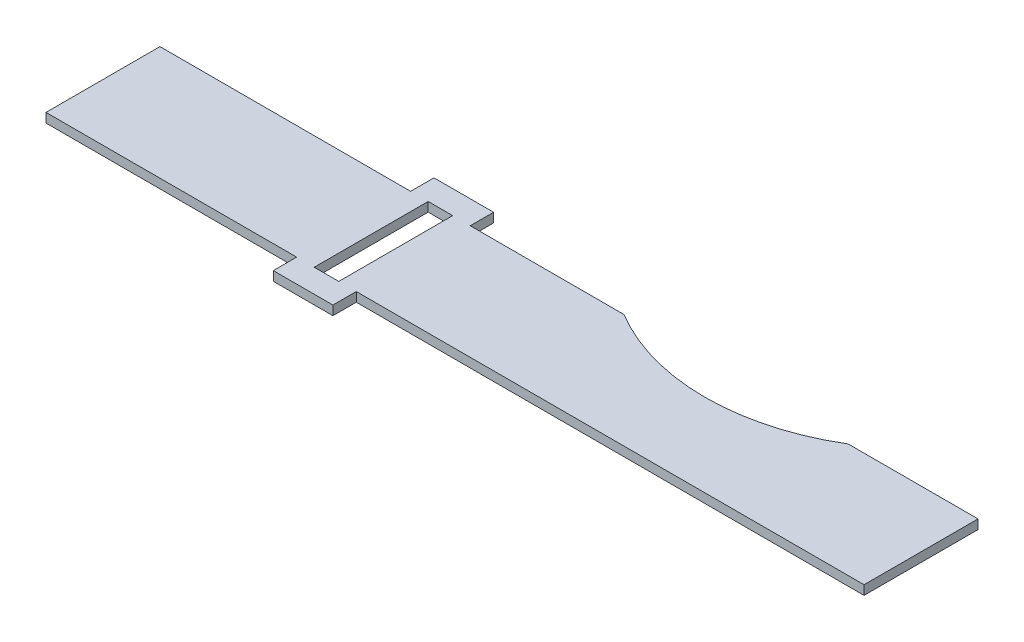
ISO-10303-21;
HEADER;
FILE_DESCRIPTION(('STEP AP214'),'2;1');
FILE_NAME('part.step','',(''),(''),'','','');
FILE_SCHEMA(('AUTOMOTIVE_DESIGN { 1 0 10303 214 1 1 1 1 }'));
ENDSEC;
DATA;
#1=APPLICATION_CONTEXT('core data for automotive mechanical design processes');
#2=APPLICATION_PROTOCOL_DEFINITION('international standard','automotive_design',2000,#1);
#3=PRODUCT_CONTEXT('',#1,'mechanical');
#4=PRODUCT('Part','Part','',(#3));
#5=PRODUCT_RELATED_PRODUCT_CATEGORY('part','',(#4));
#6=PRODUCT_DEFINITION_FORMATION('','',#4);
#7=PRODUCT_DEFINITION_CONTEXT('part definition',#1,'design');
#8=PRODUCT_DEFINITION('design','',#6,#7);
#9=PRODUCT_DEFINITION_SHAPE('','',#8);
#10=(LENGTH_UNIT() NAMED_UNIT(*) SI_UNIT(.MILLI.,.METRE.));
#11=(NAMED_UNIT(*) PLANE_ANGLE_UNIT() SI_UNIT($,.RADIAN.));
#12=(NAMED_UNIT(*) SI_UNIT($,.STERADIAN.) SOLID_ANGLE_UNIT());
#13=UNCERTAINTY_MEASURE_WITH_UNIT(LENGTH_MEASURE(1.E-05),#10,'distance_accuracy_value','');
#14=(GEOMETRIC_REPRESENTATION_CONTEXT(3) GLOBAL_UNCERTAINTY_ASSIGNED_CONTEXT((#13)) GLOBAL_UNIT_ASSIGNED_CONTEXT((#10,
#11,#12)) REPRESENTATION_CONTEXT('',''));
#15=CARTESIAN_POINT('',(0.,0.,0.));
#16=DIRECTION('',(0.,0.,1.));
#17=DIRECTION('',(1.,0.,0.));
#18=AXIS2_PLACEMENT_3D('',#15,#16,#17);
#19=CARTESIAN_POINT('',(-19.9,1.5875,0.));
#20=DIRECTION('',(1.,0.,0.));
#21=DIRECTION('',(0.,0.,-1.));
#22=AXIS2_PLACEMENT_3D('',#19,#20,#21);
#23=PLANE('',#22);
#24=DIRECTION('',(0.,0.,1.));
#25=VECTOR('',#24,1.);
#26=CARTESIAN_POINT('',(-19.9,0.,0.));
#27=LINE('',#26,#25);
#28=CARTESIAN_POINT('',(-19.9,0.,-9.75));
#29=VERTEX_POINT('',#28);
#30=CARTESIAN_POINT('',(-19.9,0.,9.75));
#31=VERTEX_POINT('',#30);
#32=EDGE_CURVE('E230',#29,#31,#27,.T.);
#33=ORIENTED_EDGE('',*,*,#32,.T.);
#34=DIRECTION('',(0.,-1.,0.));
#35=VECTOR('',#34,1.);
#36=CARTESIAN_POINT('',(-19.9,1.5875,9.75));
#37=LINE('',#36,#35);
#38=CARTESIAN_POINT('',(-19.9,1.5875,9.75));
#39=VERTEX_POINT('',#38);
#40=EDGE_CURVE('E11',#39,#31,#37,.T.);
#41=ORIENTED_EDGE('',*,*,#40,.F.);
#42=DIRECTION('',(0.,0.,1.));
#43=VECTOR('',#42,1.);
#44=CARTESIAN_POINT('',(-19.9,1.5875,0.));
#45=LINE('',#44,#43);
#46=CARTESIAN_POINT('',(-19.9,1.5875,-9.75));
#47=VERTEX_POINT('',#46);
#48=EDGE_CURVE('E183',#47,#39,#45,.T.);
#49=ORIENTED_EDGE('',*,*,#48,.F.);
#50=DIRECTION('',(0.,-1.,0.));
#51=VECTOR('',#50,1.);
#52=CARTESIAN_POINT('',(-19.9,1.5875,-9.75));
#53=LINE('',#52,#51);
#54=EDGE_CURVE('E237',#47,#29,#53,.T.);
#55=ORIENTED_EDGE('',*,*,#54,.T.);
#56=EDGE_LOOP('',(#33,#41,#49,#55));
#57=FACE_BOUND('',#56,.T.);
#58=ADVANCED_FACE('F34',(#57),#23,.F.);
#59=CARTESIAN_POINT('',(0.,1.5875,9.75));
#60=DIRECTION('',(0.,0.,-1.));
#61=DIRECTION('',(-1.,0.,0.));
#62=AXIS2_PLACEMENT_3D('',#59,#60,#61);
#63=PLANE('',#62);
#64=DIRECTION('',(1.,0.,0.));
#65=VECTOR('',#64,1.);
#66=CARTESIAN_POINT('',(0.,0.,9.75));
#67=LINE('',#66,#65);
#68=CARTESIAN_POINT('',(-24.1,0.,9.75));
#69=VERTEX_POINT('',#68);
#70=EDGE_CURVE('E175',#69,#31,#67,.T.);
#71=ORIENTED_EDGE('',*,*,#70,.F.);
#72=DIRECTION('',(0.,-1.,0.));
#73=VECTOR('',#72,1.);
#74=CARTESIAN_POINT('',(-24.1,1.5875,9.75));
#75=LINE('',#74,#73);
#76=CARTESIAN_POINT('',(-24.1,1.5875,9.75));
#77=VERTEX_POINT('',#76);
#78=EDGE_CURVE('E44',#77,#69,#75,.T.);
#79=ORIENTED_EDGE('',*,*,#78,.F.);
#80=DIRECTION('',(1.,0.,0.));
#81=VECTOR('',#80,1.);
#82=CARTESIAN_POINT('',(0.,1.5875,9.75));
#83=LINE('',#82,#81);
#84=EDGE_CURVE('E173',#77,#39,#83,.T.);
#85=ORIENTED_EDGE('',*,*,#84,.T.);
#86=ORIENTED_EDGE('',*,*,#40,.T.);
#87=EDGE_LOOP('',(#71,#79,#85,#86));
#88=FACE_BOUND('',#87,.T.);
#89=ADVANCED_FACE('F171',(#88),#63,.T.);
#90=CARTESIAN_POINT('',(-24.1,1.5875,0.));
#91=DIRECTION('',(-1.,0.,0.));
#92=DIRECTION('',(0.,0.,1.));
#93=AXIS2_PLACEMENT_3D('',#90,#91,#92);
#94=PLANE('',#93);
#95=DIRECTION('',(0.,0.,-1.));
#96=VECTOR('',#95,1.);
#97=CARTESIAN_POINT('',(-24.1,0.,0.));
#98=LINE('',#97,#96);
#99=CARTESIAN_POINT('',(-24.1,0.,-9.75));
#100=VERTEX_POINT('',#99);
#101=EDGE_CURVE('E110',#69,#100,#98,.T.);
#102=ORIENTED_EDGE('',*,*,#101,.T.);
#103=DIRECTION('',(0.,-1.,0.));
#104=VECTOR('',#103,1.);
#105=CARTESIAN_POINT('',(-24.1,1.5875,-9.75));
#106=LINE('',#105,#104);
#107=CARTESIAN_POINT('',(-24.1,1.5875,-9.75));
#108=VERTEX_POINT('',#107);
#109=EDGE_CURVE('E176',#108,#100,#106,.T.);
#110=ORIENTED_EDGE('',*,*,#109,.F.);
#111=DIRECTION('',(0.,0.,-1.));
#112=VECTOR('',#111,1.);
#113=CARTESIAN_POINT('',(-24.1,1.5875,0.));
#114=LINE('',#113,#112);
#115=EDGE_CURVE('E178',#77,#108,#114,.T.);
#116=ORIENTED_EDGE('',*,*,#115,.F.);
#117=ORIENTED_EDGE('',*,*,#78,.T.);
#118=EDGE_LOOP('',(#102,#110,#116,#117));
#119=FACE_BOUND('',#118,.T.);
#120=ADVANCED_FACE('F179',(#119),#94,.F.);
#121=CARTESIAN_POINT('',(-16.9,1.5875,0.));
#122=DIRECTION('',(-1.,0.,0.));
#123=DIRECTION('',(0.,0.,1.));
#124=AXIS2_PLACEMENT_3D('',#121,#122,#123);
#125=PLANE('',#124);
#126=DIRECTION('',(0.,0.,-1.));
#127=VECTOR('',#126,1.);
#128=CARTESIAN_POINT('',(-16.9,0.,0.));
#129=LINE('',#128,#127);
#130=CARTESIAN_POINT('',(-16.9,0.,13.75));
#131=VERTEX_POINT('',#130);
#132=CARTESIAN_POINT('',(-16.9,0.,9.75));
#133=VERTEX_POINT('',#132);
#134=EDGE_CURVE('E192',#131,#133,#129,.T.);
#135=ORIENTED_EDGE('',*,*,#134,.T.);
#136=DIRECTION('',(0.,-1.,0.));
#137=VECTOR('',#136,1.);
#138=CARTESIAN_POINT('',(-16.9,1.5875,9.75));
#139=LINE('',#138,#137);
#140=CARTESIAN_POINT('',(-16.9,1.5875,9.75));
#141=VERTEX_POINT('',#140);
#142=EDGE_CURVE('E38',#141,#133,#139,.T.);
#143=ORIENTED_EDGE('',*,*,#142,.F.);
#144=DIRECTION('',(0.,0.,-1.));
#145=VECTOR('',#144,1.);
#146=CARTESIAN_POINT('',(-16.9,1.5875,0.));
#147=LINE('',#146,#145);
#148=CARTESIAN_POINT('',(-16.9,1.5875,13.75));
#149=VERTEX_POINT('',#148);
#150=EDGE_CURVE('E236',#149,#141,#147,.T.);
#151=ORIENTED_EDGE('',*,*,#150,.F.);
#152=DIRECTION('',(0.,-1.,0.));
#153=VECTOR('',#152,1.);
#154=CARTESIAN_POINT('',(-16.9,1.5875,13.75));
#155=LINE('',#154,#153);
#156=EDGE_CURVE('E191',#149,#131,#155,.T.);
#157=ORIENTED_EDGE('',*,*,#156,.T.);
#158=EDGE_LOOP('',(#135,#143,#151,#157));
#159=FACE_BOUND('',#158,.T.);
#160=ADVANCED_FACE('F36',(#159),#125,.F.);
#161=CARTESIAN_POINT('',(0.,1.5875,9.75));
#162=DIRECTION('',(0.,0.,-1.));
#163=DIRECTION('',(-1.,0.,0.));
#164=AXIS2_PLACEMENT_3D('',#161,#162,#163);
#165=PLANE('',#164);
#166=DIRECTION('',(1.,0.,0.));
#167=VECTOR('',#166,1.);
#168=CARTESIAN_POINT('',(0.,0.,9.75));
#169=LINE('',#168,#167);
#170=CARTESIAN_POINT('',(70.,0.,9.75));
#171=VERTEX_POINT('',#170);
#172=EDGE_CURVE('E195',#133,#171,#169,.T.);
#173=ORIENTED_EDGE('',*,*,#172,.T.);
#174=DIRECTION('',(0.,-1.,0.));
#175=VECTOR('',#174,1.);
#176=CARTESIAN_POINT('',(70.,1.5875,9.75));
#177=LINE('',#176,#175);
#178=CARTESIAN_POINT('',(70.,1.5875,9.75));
#179=VERTEX_POINT('',#178);
#180=EDGE_CURVE('E263',#179,#171,#177,.T.);
#181=ORIENTED_EDGE('',*,*,#180,.F.);
#182=DIRECTION('',(1.,0.,0.));
#183=VECTOR('',#182,1.);
#184=CARTESIAN_POINT('',(0.,1.5875,9.75));
#185=LINE('',#184,#183);
#186=EDGE_CURVE('E125',#141,#179,#185,.T.);
#187=ORIENTED_EDGE('',*,*,#186,.F.);
#188=ORIENTED_EDGE('',*,*,#142,.T.);
#189=EDGE_LOOP('',(#173,#181,#187,#188));
#190=FACE_BOUND('',#189,.T.);
#191=ADVANCED_FACE('F269',(#190),#165,.F.);
#192=CARTESIAN_POINT('',(70.,1.5875,0.));
#193=DIRECTION('',(-1.,0.,0.));
#194=DIRECTION('',(0.,0.,1.));
#195=AXIS2_PLACEMENT_3D('',#192,#193,#194);
#196=PLANE('',#195);
#197=DIRECTION('',(0.,0.,-1.));
#198=VECTOR('',#197,1.);
#199=CARTESIAN_POINT('',(70.,0.,0.));
#200=LINE('',#199,#198);
#201=CARTESIAN_POINT('',(70.,0.,-9.75));
#202=VERTEX_POINT('',#201);
#203=EDGE_CURVE('E197',#171,#202,#200,.T.);
#204=ORIENTED_EDGE('',*,*,#203,.T.);
#205=DIRECTION('',(0.,-1.,0.));
#206=VECTOR('',#205,1.);
#207=CARTESIAN_POINT('',(70.,1.5875,-9.75));
#208=LINE('',#207,#206);
#209=CARTESIAN_POINT('',(70.,1.5875,-9.75));
#210=VERTEX_POINT('',#209);
#211=EDGE_CURVE('E262',#210,#202,#208,.T.);
#212=ORIENTED_EDGE('',*,*,#211,.F.);
#213=DIRECTION('',(0.,0.,-1.));
#214=VECTOR('',#213,1.);
#215=CARTESIAN_POINT('',(70.,1.5875,0.));
#216=LINE('',#215,#214);
#217=EDGE_CURVE('E561',#179,#210,#216,.T.);
#218=ORIENTED_EDGE('',*,*,#217,.F.);
#219=ORIENTED_EDGE('',*,*,#180,.T.);
#220=EDGE_LOOP('',(#204,#212,#218,#219));
#221=FACE_BOUND('',#220,.T.);
#222=ADVANCED_FACE('F338',(#221),#196,.F.);
#223=CARTESIAN_POINT('',(0.,1.5875,-9.75));
#224=DIRECTION('',(0.,0.,-1.));
#225=DIRECTION('',(-1.,0.,0.));
#226=AXIS2_PLACEMENT_3D('',#223,#224,#225);
#227=PLANE('',#226);
#228=DIRECTION('',(1.,0.,0.));
#229=VECTOR('',#228,1.);
#230=CARTESIAN_POINT('',(0.,0.,-9.75));
#231=LINE('',#230,#229);
#232=CARTESIAN_POINT('',(47.7914772792944,0.,-9.74999999999999));
#233=VERTEX_POINT('',#232);
#234=EDGE_CURVE('E200',#233,#202,#231,.T.);
#235=ORIENTED_EDGE('',*,*,#234,.F.);
#236=DIRECTION('',(0.,-1.,0.));
#237=VECTOR('',#236,1.);
#238=CARTESIAN_POINT('',(47.7914772792944,1.5875,-9.74999999999999));
#239=LINE('',#238,#237);
#240=CARTESIAN_POINT('',(47.7914772792944,1.5875,-9.74999999999999));
#241=VERTEX_POINT('',#240);
#242=EDGE_CURVE('E260',#241,#233,#239,.T.);
#243=ORIENTED_EDGE('',*,*,#242,.F.);
#244=DIRECTION('',(1.,0.,0.));
#245=VECTOR('',#244,1.);
#246=CARTESIAN_POINT('',(0.,1.5875,-9.75));
#247=LINE('',#246,#245);
#248=EDGE_CURVE('E337',#241,#210,#247,.T.);
#249=ORIENTED_EDGE('',*,*,#248,.T.);
#250=ORIENTED_EDGE('',*,*,#211,.T.);
#251=EDGE_LOOP('',(#235,#243,#249,#250));
#252=FACE_BOUND('',#251,.T.);
#253=ADVANCED_FACE('F333',(#252),#227,.T.);
#254=CARTESIAN_POINT('',(28.6071818782258,1.5875,-41.5685050628242));
#255=DIRECTION('',(0.,-1.,0.));
#256=DIRECTION('',(0.,0.,-1.));
#257=AXIS2_PLACEMENT_3D('',#254,#255,#256);
#258=CYLINDRICAL_SURFACE('',#257,37.1544674900398);
#259=CARTESIAN_POINT('',(28.6071818782258,0.,-41.5685050628242));
#260=DIRECTION('',(0.,1.,0.));
#261=DIRECTION('',(0.,0.,1.));
#262=AXIS2_PLACEMENT_3D('',#259,#260,#261);
#263=CIRCLE('',#262,37.1544674900398);
#264=CARTESIAN_POINT('',(9.42288647715725,0.,-9.74999999999999));
#265=VERTEX_POINT('',#264);
#266=EDGE_CURVE('E203',#265,#233,#263,.T.);
#267=ORIENTED_EDGE('',*,*,#266,.F.);
#268=DIRECTION('',(0.,-1.,0.));
#269=VECTOR('',#268,1.);
#270=CARTESIAN_POINT('',(9.42288647715725,1.5875,-9.74999999999999));
#271=LINE('',#270,#269);
#272=CARTESIAN_POINT('',(9.42288647715725,1.5875,-9.74999999999999));
#273=VERTEX_POINT('',#272);
#274=EDGE_CURVE('E258',#273,#265,#271,.T.);
#275=ORIENTED_EDGE('',*,*,#274,.F.);
#276=CARTESIAN_POINT('',(28.6071818782258,1.5875,-41.5685050628242));
#277=DIRECTION('',(0.,1.,0.));
#278=DIRECTION('',(0.,0.,1.));
#279=AXIS2_PLACEMENT_3D('',#276,#277,#278);
#280=CIRCLE('',#279,37.1544674900398);
#281=EDGE_CURVE('E566',#273,#241,#280,.T.);
#282=ORIENTED_EDGE('',*,*,#281,.T.);
#283=ORIENTED_EDGE('',*,*,#242,.T.);
#284=EDGE_LOOP('',(#267,#275,#282,#283));
#285=FACE_BOUND('',#284,.T.);
#286=ADVANCED_FACE('F330',(#285),#258,.F.);
#287=CARTESIAN_POINT('',(-16.9,0.,-9.75));
#288=VERTEX_POINT('',#287);
#289=EDGE_CURVE('E204',#288,#265,#231,.T.);
#290=ORIENTED_EDGE('',*,*,#289,.F.);
#291=DIRECTION('',(0.,-1.,0.));
#292=VECTOR('',#291,1.);
#293=CARTESIAN_POINT('',(-16.9,1.5875,-9.75));
#294=LINE('',#293,#292);
#295=CARTESIAN_POINT('',(-16.9,1.5875,-9.75));
#296=VERTEX_POINT('',#295);
#297=EDGE_CURVE('E256',#296,#288,#294,.T.);
#298=ORIENTED_EDGE('',*,*,#297,.F.);
#299=EDGE_CURVE('E326',#296,#273,#247,.T.);
#300=ORIENTED_EDGE('',*,*,#299,.T.);
#301=ORIENTED_EDGE('',*,*,#274,.T.);
#302=EDGE_LOOP('',(#290,#298,#300,#301));
#303=FACE_BOUND('',#302,.T.);
#304=ADVANCED_FACE('F323',(#303),#227,.T.);
#305=CARTESIAN_POINT('',(-16.9,1.5875,0.));
#306=DIRECTION('',(-1.,0.,0.));
#307=DIRECTION('',(0.,0.,1.));
#308=AXIS2_PLACEMENT_3D('',#305,#306,#307);
#309=PLANE('',#308);
#310=DIRECTION('',(0.,0.,-1.));
#311=VECTOR('',#310,1.);
#312=CARTESIAN_POINT('',(-16.9,0.,0.));
#313=LINE('',#312,#311);
#314=CARTESIAN_POINT('',(-16.9,0.,-13.75));
#315=VERTEX_POINT('',#314);
#316=EDGE_CURVE('E207',#288,#315,#313,.T.);
#317=ORIENTED_EDGE('',*,*,#316,.T.);
#318=DIRECTION('',(0.,-1.,0.));
#319=VECTOR('',#318,1.);
#320=CARTESIAN_POINT('',(-16.9,1.5875,-13.75));
#321=LINE('',#320,#319);
#322=CARTESIAN_POINT('',(-16.9,1.5875,-13.75));
#323=VERTEX_POINT('',#322);
#324=EDGE_CURVE('E253',#323,#315,#321,.T.);
#325=ORIENTED_EDGE('',*,*,#324,.F.);
#326=DIRECTION('',(0.,0.,-1.));
#327=VECTOR('',#326,1.);
#328=CARTESIAN_POINT('',(-16.9,1.5875,0.));
#329=LINE('',#328,#327);
#330=EDGE_CURVE('E318',#296,#323,#329,.T.);
#331=ORIENTED_EDGE('',*,*,#330,.F.);
#332=ORIENTED_EDGE('',*,*,#297,.T.);
#333=EDGE_LOOP('',(#317,#325,#331,#332));
#334=FACE_BOUND('',#333,.T.);
#335=ADVANCED_FACE('F317',(#334),#309,.F.);
#336=CARTESIAN_POINT('',(0.,1.5875,-13.75));
#337=DIRECTION('',(0.,0.,1.));
#338=DIRECTION('',(1.,0.,0.));
#339=AXIS2_PLACEMENT_3D('',#336,#337,#338);
#340=PLANE('',#339);
#341=DIRECTION('',(-1.,0.,0.));
#342=VECTOR('',#341,1.);
#343=CARTESIAN_POINT('',(0.,0.,-13.75));
#344=LINE('',#343,#342);
#345=CARTESIAN_POINT('',(-27.1,0.,-13.75));
#346=VERTEX_POINT('',#345);
#347=EDGE_CURVE('E209',#315,#346,#344,.T.);
#348=ORIENTED_EDGE('',*,*,#347,.T.);
#349=DIRECTION('',(0.,-1.,0.));
#350=VECTOR('',#349,1.);
#351=CARTESIAN_POINT('',(-27.1,1.5875,-13.75));
#352=LINE('',#351,#350);
#353=CARTESIAN_POINT('',(-27.1,1.5875,-13.75));
#354=VERTEX_POINT('',#353);
#355=EDGE_CURVE('E251',#354,#346,#352,.T.);
#356=ORIENTED_EDGE('',*,*,#355,.F.);
#357=DIRECTION('',(-1.,0.,0.));
#358=VECTOR('',#357,1.);
#359=CARTESIAN_POINT('',(0.,1.5875,-13.75));
#360=LINE('',#359,#358);
#361=EDGE_CURVE('E314',#323,#354,#360,.T.);
#362=ORIENTED_EDGE('',*,*,#361,.F.);
#363=ORIENTED_EDGE('',*,*,#324,.T.);
#364=EDGE_LOOP('',(#348,#356,#362,#363));
#365=FACE_BOUND('',#364,.T.);
#366=ADVANCED_FACE('F312',(#365),#340,.F.);
#367=CARTESIAN_POINT('',(-27.1,1.5875,0.));
#368=DIRECTION('',(-1.,0.,0.));
#369=DIRECTION('',(0.,0.,1.));
#370=AXIS2_PLACEMENT_3D('',#367,#368,#369);
#371=PLANE('',#370);
#372=DIRECTION('',(0.,0.,-1.));
#373=VECTOR('',#372,1.);
#374=CARTESIAN_POINT('',(-27.1,0.,0.));
#375=LINE('',#374,#373);
#376=CARTESIAN_POINT('',(-27.1,0.,-9.75));
#377=VERTEX_POINT('',#376);
#378=EDGE_CURVE('E212',#377,#346,#375,.T.);
#379=ORIENTED_EDGE('',*,*,#378,.F.);
#380=DIRECTION('',(0.,-1.,0.));
#381=VECTOR('',#380,1.);
#382=CARTESIAN_POINT('',(-27.1,1.5875,-9.75));
#383=LINE('',#382,#381);
#384=CARTESIAN_POINT('',(-27.1,1.5875,-9.75));
#385=VERTEX_POINT('',#384);
#386=EDGE_CURVE('E249',#385,#377,#383,.T.);
#387=ORIENTED_EDGE('',*,*,#386,.F.);
#388=DIRECTION('',(0.,0.,-1.));
#389=VECTOR('',#388,1.);
#390=CARTESIAN_POINT('',(-27.1,1.5875,0.));
#391=LINE('',#390,#389);
#392=EDGE_CURVE('E309',#385,#354,#391,.T.);
#393=ORIENTED_EDGE('',*,*,#392,.T.);
#394=ORIENTED_EDGE('',*,*,#355,.T.);
#395=EDGE_LOOP('',(#379,#387,#393,#394));
#396=FACE_BOUND('',#395,.T.);
#397=ADVANCED_FACE('F305',(#396),#371,.T.);
#398=CARTESIAN_POINT('',(0.,1.5875,-9.75));
#399=DIRECTION('',(0.,0.,-1.));
#400=DIRECTION('',(-1.,0.,0.));
#401=AXIS2_PLACEMENT_3D('',#398,#399,#400);
#402=PLANE('',#401);
#403=DIRECTION('',(1.,0.,0.));
#404=VECTOR('',#403,1.);
#405=CARTESIAN_POINT('',(0.,0.,-9.75));
#406=LINE('',#405,#404);
#407=CARTESIAN_POINT('',(-70.,0.,-9.75));
#408=VERTEX_POINT('',#407);
#409=EDGE_CURVE('E215',#408,#377,#406,.T.);
#410=ORIENTED_EDGE('',*,*,#409,.F.);
#411=DIRECTION('',(0.,-1.,0.));
#412=VECTOR('',#411,1.);
#413=CARTESIAN_POINT('',(-70.,1.5875,-9.75));
#414=LINE('',#413,#412);
#415=CARTESIAN_POINT('',(-70.,1.5875,-9.75));
#416=VERTEX_POINT('',#415);
#417=EDGE_CURVE('E247',#416,#408,#414,.T.);
#418=ORIENTED_EDGE('',*,*,#417,.F.);
#419=DIRECTION('',(1.,0.,0.));
#420=VECTOR('',#419,1.);
#421=CARTESIAN_POINT('',(0.,1.5875,-9.75));
#422=LINE('',#421,#420);
#423=EDGE_CURVE('E571',#416,#385,#422,.T.);
#424=ORIENTED_EDGE('',*,*,#423,.T.);
#425=ORIENTED_EDGE('',*,*,#386,.T.);
#426=EDGE_LOOP('',(#410,#418,#424,#425));
#427=FACE_BOUND('',#426,.T.);
#428=ADVANCED_FACE('F300',(#427),#402,.T.);
#429=CARTESIAN_POINT('',(-70.,1.5875,0.));
#430=DIRECTION('',(-1.,0.,0.));
#431=DIRECTION('',(0.,0.,1.));
#432=AXIS2_PLACEMENT_3D('',#429,#430,#431);
#433=PLANE('',#432);
#434=DIRECTION('',(0.,0.,-1.));
#435=VECTOR('',#434,1.);
#436=CARTESIAN_POINT('',(-70.,0.,0.));
#437=LINE('',#436,#435);
#438=CARTESIAN_POINT('',(-70.,0.,9.75));
#439=VERTEX_POINT('',#438);
#440=EDGE_CURVE('E218',#439,#408,#437,.T.);
#441=ORIENTED_EDGE('',*,*,#440,.F.);
#442=DIRECTION('',(0.,-1.,0.));
#443=VECTOR('',#442,1.);
#444=CARTESIAN_POINT('',(-70.,1.5875,9.75));
#445=LINE('',#444,#443);
#446=CARTESIAN_POINT('',(-70.,1.5875,9.75));
#447=VERTEX_POINT('',#446);
#448=EDGE_CURVE('E245',#447,#439,#445,.T.);
#449=ORIENTED_EDGE('',*,*,#448,.F.);
#450=DIRECTION('',(0.,0.,-1.));
#451=VECTOR('',#450,1.);
#452=CARTESIAN_POINT('',(-70.,1.5875,0.));
#453=LINE('',#452,#451);
#454=EDGE_CURVE('E296',#447,#416,#453,.T.);
#455=ORIENTED_EDGE('',*,*,#454,.T.);
#456=ORIENTED_EDGE('',*,*,#417,.T.);
#457=EDGE_LOOP('',(#441,#449,#455,#456));
#458=FACE_BOUND('',#457,.T.);
#459=ADVANCED_FACE('F291',(#458),#433,.T.);
#460=CARTESIAN_POINT('',(0.,1.5875,9.75));
#461=DIRECTION('',(0.,0.,-1.));
#462=DIRECTION('',(-1.,0.,0.));
#463=AXIS2_PLACEMENT_3D('',#460,#461,#462);
#464=PLANE('',#463);
#465=DIRECTION('',(1.,0.,0.));
#466=VECTOR('',#465,1.);
#467=CARTESIAN_POINT('',(0.,0.,9.75));
#468=LINE('',#467,#466);
#469=CARTESIAN_POINT('',(-27.1,0.,9.75));
#470=VERTEX_POINT('',#469);
#471=EDGE_CURVE('E221',#439,#470,#468,.T.);
#472=ORIENTED_EDGE('',*,*,#471,.T.);
#473=DIRECTION('',(0.,-1.,0.));
#474=VECTOR('',#473,1.);
#475=CARTESIAN_POINT('',(-27.1,1.5875,9.75));
#476=LINE('',#475,#474);
#477=CARTESIAN_POINT('',(-27.1,1.5875,9.75));
#478=VERTEX_POINT('',#477);
#479=EDGE_CURVE('E243',#478,#470,#476,.T.);
#480=ORIENTED_EDGE('',*,*,#479,.F.);
#481=DIRECTION('',(1.,0.,0.));
#482=VECTOR('',#481,1.);
#483=CARTESIAN_POINT('',(0.,1.5875,9.75));
#484=LINE('',#483,#482);
#485=EDGE_CURVE('E574',#447,#478,#484,.T.);
#486=ORIENTED_EDGE('',*,*,#485,.F.);
#487=ORIENTED_EDGE('',*,*,#448,.T.);
#488=EDGE_LOOP('',(#472,#480,#486,#487));
#489=FACE_BOUND('',#488,.T.);
#490=ADVANCED_FACE('F361',(#489),#464,.F.);
#491=CARTESIAN_POINT('',(-27.1,1.5875,0.));
#492=DIRECTION('',(-1.,0.,0.));
#493=DIRECTION('',(0.,0.,1.));
#494=AXIS2_PLACEMENT_3D('',#491,#492,#493);
#495=PLANE('',#494);
#496=DIRECTION('',(0.,0.,-1.));
#497=VECTOR('',#496,1.);
#498=CARTESIAN_POINT('',(-27.1,0.,0.));
#499=LINE('',#498,#497);
#500=CARTESIAN_POINT('',(-27.1,0.,13.75));
#501=VERTEX_POINT('',#500);
#502=EDGE_CURVE('E224',#501,#470,#499,.T.);
#503=ORIENTED_EDGE('',*,*,#502,.F.);
#504=DIRECTION('',(0.,-1.,0.));
#505=VECTOR('',#504,1.);
#506=CARTESIAN_POINT('',(-27.1,1.5875,13.75));
#507=LINE('',#506,#505);
#508=CARTESIAN_POINT('',(-27.1,1.5875,13.75));
#509=VERTEX_POINT('',#508);
#510=EDGE_CURVE('E241',#509,#501,#507,.T.);
#511=ORIENTED_EDGE('',*,*,#510,.F.);
#512=DIRECTION('',(0.,0.,-1.));
#513=VECTOR('',#512,1.);
#514=CARTESIAN_POINT('',(-27.1,1.5875,0.));
#515=LINE('',#514,#513);
#516=EDGE_CURVE('E576',#509,#478,#515,.T.);
#517=ORIENTED_EDGE('',*,*,#516,.T.);
#518=ORIENTED_EDGE('',*,*,#479,.T.);
#519=EDGE_LOOP('',(#503,#511,#517,#518));
#520=FACE_BOUND('',#519,.T.);
#521=ADVANCED_FACE('F285',(#520),#495,.T.);
#522=CARTESIAN_POINT('',(0.,1.5875,13.75));
#523=DIRECTION('',(0.,0.,1.));
#524=DIRECTION('',(1.,0.,0.));
#525=AXIS2_PLACEMENT_3D('',#522,#523,#524);
#526=PLANE('',#525);
#527=DIRECTION('',(-1.,0.,0.));
#528=VECTOR('',#527,1.);
#529=CARTESIAN_POINT('',(0.,0.,13.75));
#530=LINE('',#529,#528);
#531=EDGE_CURVE('E227',#131,#501,#530,.T.);
#532=ORIENTED_EDGE('',*,*,#531,.F.);
#533=ORIENTED_EDGE('',*,*,#156,.F.);
#534=DIRECTION('',(-1.,0.,0.));
#535=VECTOR('',#534,1.);
#536=CARTESIAN_POINT('',(0.,1.5875,13.75));
#537=LINE('',#536,#535);
#538=EDGE_CURVE('E186',#149,#509,#537,.T.);
#539=ORIENTED_EDGE('',*,*,#538,.T.);
#540=ORIENTED_EDGE('',*,*,#510,.T.);
#541=EDGE_LOOP('',(#532,#533,#539,#540));
#542=FACE_BOUND('',#541,.T.);
#543=ADVANCED_FACE('F278',(#542),#526,.T.);
#544=CARTESIAN_POINT('',(0.,1.5875,-9.75));
#545=DIRECTION('',(0.,0.,-1.));
#546=DIRECTION('',(-1.,0.,0.));
#547=AXIS2_PLACEMENT_3D('',#544,#545,#546);
#548=PLANE('',#547);
#549=DIRECTION('',(1.,0.,0.));
#550=VECTOR('',#549,1.);
#551=CARTESIAN_POINT('',(0.,0.,-9.75));
#552=LINE('',#551,#550);
#553=EDGE_CURVE('E116',#100,#29,#552,.T.);
#554=ORIENTED_EDGE('',*,*,#553,.T.);
#555=ORIENTED_EDGE('',*,*,#54,.F.);
#556=DIRECTION('',(1.,0.,0.));
#557=VECTOR('',#556,1.);
#558=CARTESIAN_POINT('',(0.,1.5875,-9.75));
#559=LINE('',#558,#557);
#560=EDGE_CURVE('E53',#108,#47,#559,.T.);
#561=ORIENTED_EDGE('',*,*,#560,.F.);
#562=ORIENTED_EDGE('',*,*,#109,.T.);
#563=EDGE_LOOP('',(#554,#555,#561,#562));
#564=FACE_BOUND('',#563,.T.);
#565=ADVANCED_FACE('F358',(#564),#548,.F.);
#566=CARTESIAN_POINT('',(0.,1.5875,0.));
#567=DIRECTION('',(0.,1.,0.));
#568=DIRECTION('',(0.,0.,1.));
#569=AXIS2_PLACEMENT_3D('',#566,#567,#568);
#570=PLANE('',#569);
#571=ORIENTED_EDGE('',*,*,#150,.T.);
#572=ORIENTED_EDGE('',*,*,#186,.T.);
#573=ORIENTED_EDGE('',*,*,#217,.T.);
#574=ORIENTED_EDGE('',*,*,#248,.F.);
#575=ORIENTED_EDGE('',*,*,#281,.F.);
#576=ORIENTED_EDGE('',*,*,#299,.F.);
#577=ORIENTED_EDGE('',*,*,#330,.T.);
#578=ORIENTED_EDGE('',*,*,#361,.T.);
#579=ORIENTED_EDGE('',*,*,#392,.F.);
#580=ORIENTED_EDGE('',*,*,#423,.F.);
#581=ORIENTED_EDGE('',*,*,#454,.F.);
#582=ORIENTED_EDGE('',*,*,#485,.T.);
#583=ORIENTED_EDGE('',*,*,#516,.F.);
#584=ORIENTED_EDGE('',*,*,#538,.F.);
#585=EDGE_LOOP('',(#571,#572,#573,#574,#575,#576,#577,#578,#579,#580,#581,#582,#583,#584));
#586=FACE_BOUND('',#585,.T.);
#587=ORIENTED_EDGE('',*,*,#48,.T.);
#588=ORIENTED_EDGE('',*,*,#84,.F.);
#589=ORIENTED_EDGE('',*,*,#115,.T.);
#590=ORIENTED_EDGE('',*,*,#560,.T.);
#591=EDGE_LOOP('',(#587,#588,#589,#590));
#592=FACE_BOUND('',#591,.T.);
#593=ADVANCED_FACE('F181',(#586,#592),#570,.T.);
#594=CARTESIAN_POINT('',(0.,0.,0.));
#595=DIRECTION('',(0.,1.,0.));
#596=DIRECTION('',(0.,0.,1.));
#597=AXIS2_PLACEMENT_3D('',#594,#595,#596);
#598=PLANE('',#597);
#599=ORIENTED_EDGE('',*,*,#134,.F.);
#600=ORIENTED_EDGE('',*,*,#531,.T.);
#601=ORIENTED_EDGE('',*,*,#502,.T.);
#602=ORIENTED_EDGE('',*,*,#471,.F.);
#603=ORIENTED_EDGE('',*,*,#440,.T.);
#604=ORIENTED_EDGE('',*,*,#409,.T.);
#605=ORIENTED_EDGE('',*,*,#378,.T.);
#606=ORIENTED_EDGE('',*,*,#347,.F.);
#607=ORIENTED_EDGE('',*,*,#316,.F.);
#608=ORIENTED_EDGE('',*,*,#289,.T.);
#609=ORIENTED_EDGE('',*,*,#266,.T.);
#610=ORIENTED_EDGE('',*,*,#234,.T.);
#611=ORIENTED_EDGE('',*,*,#203,.F.);
#612=ORIENTED_EDGE('',*,*,#172,.F.);
#613=EDGE_LOOP('',(#599,#600,#601,#602,#603,#604,#605,#606,#607,#608,#609,#610,#611,#612));
#614=FACE_BOUND('',#613,.T.);
#615=ORIENTED_EDGE('',*,*,#32,.F.);
#616=ORIENTED_EDGE('',*,*,#553,.F.);
#617=ORIENTED_EDGE('',*,*,#101,.F.);
#618=ORIENTED_EDGE('',*,*,#70,.T.);
#619=EDGE_LOOP('',(#615,#616,#617,#618));
#620=FACE_BOUND('',#619,.T.);
#621=ADVANCED_FACE('F275',(#614,#620),#598,.F.);
#622=CLOSED_SHELL('',(#58,#89,#120,#160,#191,#222,#253,#286,#304,#335,#366,#397,#428,#459,#490,
#521,#543,#565,#593,#621));
#623=MANIFOLD_SOLID_BREP('B2',#622);
#624=ADVANCED_BREP_SHAPE_REPRESENTATION('',(#18,#623),#14);
#625=SHAPE_DEFINITION_REPRESENTATION(#9,#624);
ENDSEC;
END-ISO-10303-21;
